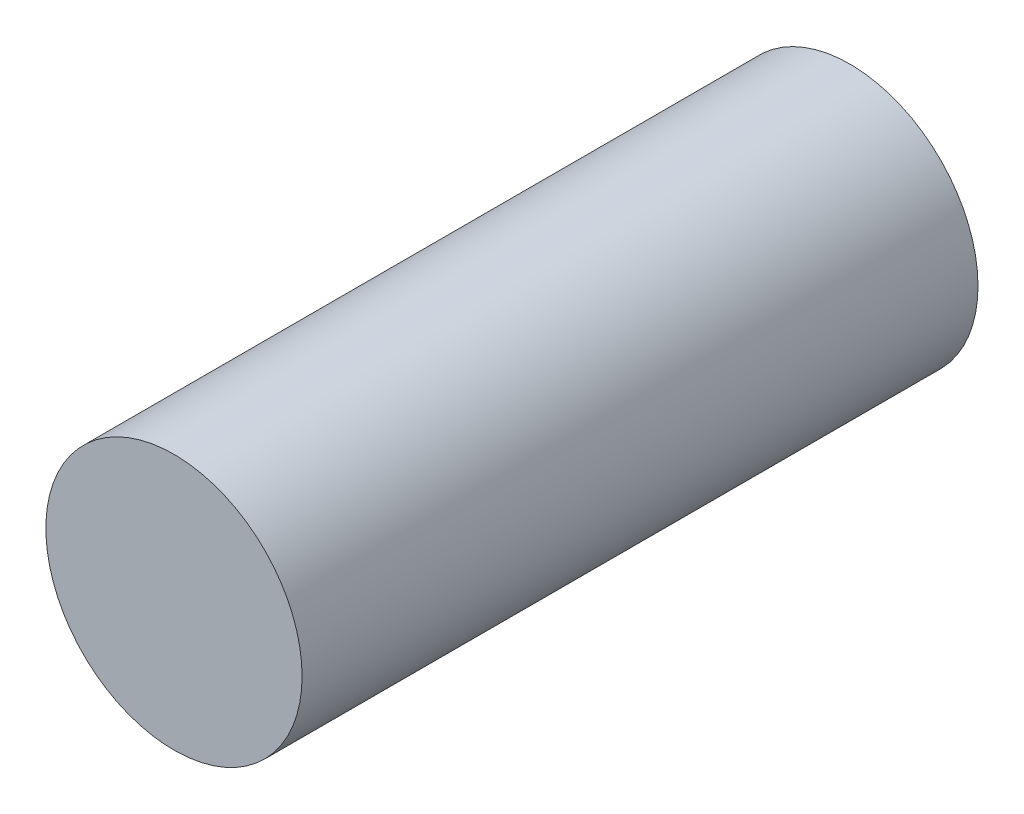
ISO-10303-21;
HEADER;
FILE_DESCRIPTION(('STEP AP214'),'2;1');
FILE_NAME('part.step','',(''),(''),'','','');
FILE_SCHEMA(('AUTOMOTIVE_DESIGN { 1 0 10303 214 1 1 1 1 }'));
ENDSEC;
DATA;
#1=APPLICATION_CONTEXT('core data for automotive mechanical design processes');
#2=APPLICATION_PROTOCOL_DEFINITION('international standard','automotive_design',2000,#1);
#3=PRODUCT_CONTEXT('',#1,'mechanical');
#4=PRODUCT('Part','Part','',(#3));
#5=PRODUCT_RELATED_PRODUCT_CATEGORY('part','',(#4));
#6=PRODUCT_DEFINITION_FORMATION('','',#4);
#7=PRODUCT_DEFINITION_CONTEXT('part definition',#1,'design');
#8=PRODUCT_DEFINITION('design','',#6,#7);
#9=PRODUCT_DEFINITION_SHAPE('','',#8);
#10=(LENGTH_UNIT() NAMED_UNIT(*) SI_UNIT(.MILLI.,.METRE.));
#11=(NAMED_UNIT(*) PLANE_ANGLE_UNIT() SI_UNIT($,.RADIAN.));
#12=(NAMED_UNIT(*) SI_UNIT($,.STERADIAN.) SOLID_ANGLE_UNIT());
#13=UNCERTAINTY_MEASURE_WITH_UNIT(LENGTH_MEASURE(1.E-05),#10,'distance_accuracy_value','');
#14=(GEOMETRIC_REPRESENTATION_CONTEXT(3) GLOBAL_UNCERTAINTY_ASSIGNED_CONTEXT((#13)) GLOBAL_UNIT_ASSIGNED_CONTEXT((#10,
#11,#12)) REPRESENTATION_CONTEXT('',''));
#15=CARTESIAN_POINT('',(0.,0.,0.));
#16=DIRECTION('',(0.,0.,1.));
#17=DIRECTION('',(1.,0.,0.));
#18=AXIS2_PLACEMENT_3D('',#15,#16,#17);
#19=CARTESIAN_POINT('',(0.,0.,48.8));
#20=DIRECTION('',(0.,0.,-1.));
#21=DIRECTION('',(-1.,0.,0.));
#22=AXIS2_PLACEMENT_3D('',#19,#20,#21);
#23=CYLINDRICAL_SURFACE('',#22,9.25);
#24=CARTESIAN_POINT('',(0.,0.,48.8));
#25=DIRECTION('',(0.,0.,1.));
#26=DIRECTION('',(1.,0.,0.));
#27=AXIS2_PLACEMENT_3D('',#24,#25,#26);
#28=CIRCLE('',#27,9.25);
#29=CARTESIAN_POINT('',(9.25,0.,48.8));
#30=VERTEX_POINT('',#29);
#31=EDGE_CURVE('E10',#30,#30,#28,.T.);
#32=ORIENTED_EDGE('',*,*,#31,.F.);
#33=EDGE_LOOP('',(#32));
#34=FACE_BOUND('',#33,.T.);
#35=CARTESIAN_POINT('',(0.,0.,0.));
#36=DIRECTION('',(0.,0.,1.));
#37=DIRECTION('',(1.,0.,0.));
#38=AXIS2_PLACEMENT_3D('',#35,#36,#37);
#39=CIRCLE('',#38,9.25);
#40=CARTESIAN_POINT('',(9.25,0.,0.));
#41=VERTEX_POINT('',#40);
#42=EDGE_CURVE('E35',#41,#41,#39,.T.);
#43=ORIENTED_EDGE('',*,*,#42,.T.);
#44=EDGE_LOOP('',(#43));
#45=FACE_BOUND('',#44,.T.);
#46=ADVANCED_FACE('F32',(#34,#45),#23,.T.);
#47=CARTESIAN_POINT('',(0.,0.,48.8));
#48=DIRECTION('',(0.,0.,1.));
#49=DIRECTION('',(1.,0.,0.));
#50=AXIS2_PLACEMENT_3D('',#47,#48,#49);
#51=PLANE('',#50);
#52=ORIENTED_EDGE('',*,*,#31,.T.);
#53=EDGE_LOOP('',(#52));
#54=FACE_BOUND('',#53,.T.);
#55=ADVANCED_FACE('F47',(#54),#51,.T.);
#56=CARTESIAN_POINT('',(0.,0.,0.));
#57=DIRECTION('',(0.,0.,1.));
#58=DIRECTION('',(1.,0.,0.));
#59=AXIS2_PLACEMENT_3D('',#56,#57,#58);
#60=PLANE('',#59);
#61=ORIENTED_EDGE('',*,*,#42,.F.);
#62=EDGE_LOOP('',(#61));
#63=FACE_BOUND('',#62,.T.);
#64=ADVANCED_FACE('F45',(#63),#60,.F.);
#65=CLOSED_SHELL('',(#46,#55,#64));
#66=MANIFOLD_SOLID_BREP('B2',#65);
#67=ADVANCED_BREP_SHAPE_REPRESENTATION('',(#18,#66),#14);
#68=SHAPE_DEFINITION_REPRESENTATION(#9,#67);
ENDSEC;
END-ISO-10303-21;
